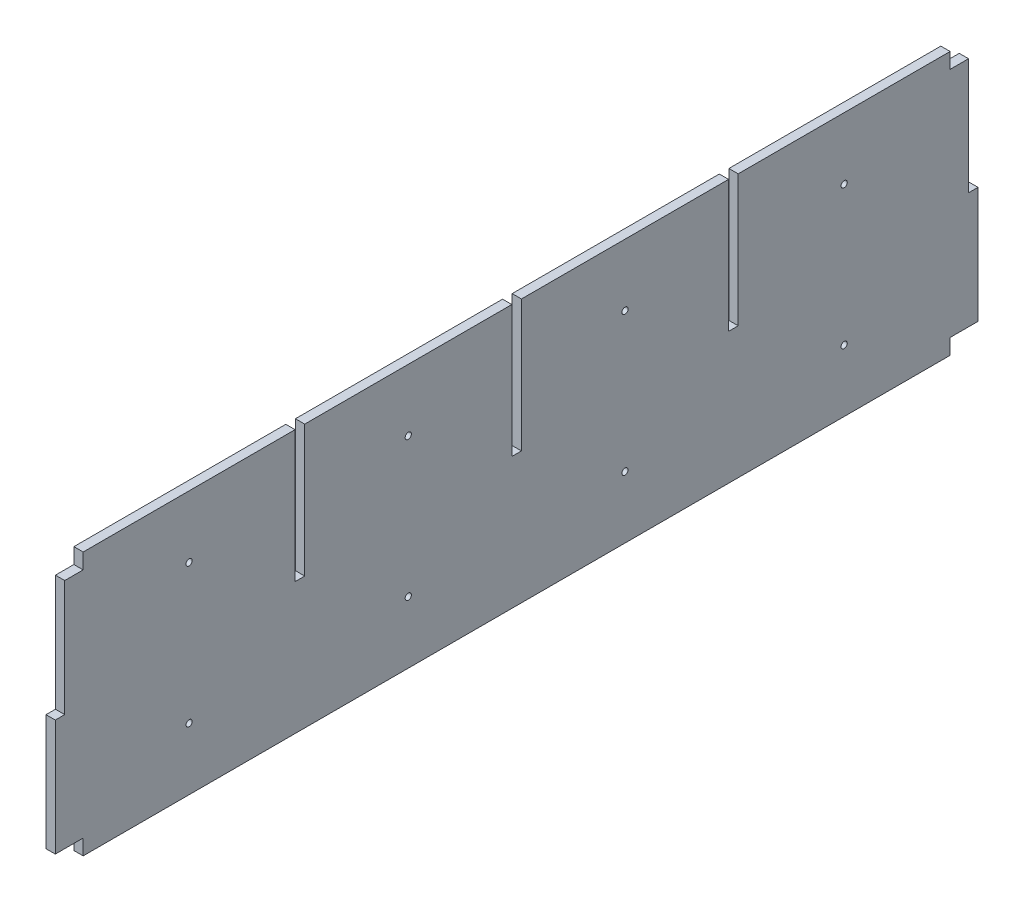
ISO-10303-21;
HEADER;
FILE_DESCRIPTION(('STEP AP214'),'2;1');
FILE_NAME('part.step','',(''),(''),'','','');
FILE_SCHEMA(('AUTOMOTIVE_DESIGN { 1 0 10303 214 1 1 1 1 }'));
ENDSEC;
DATA;
#1=APPLICATION_CONTEXT('core data for automotive mechanical design processes');
#2=APPLICATION_PROTOCOL_DEFINITION('international standard','automotive_design',2000,#1);
#3=PRODUCT_CONTEXT('',#1,'mechanical');
#4=PRODUCT('Part','Part','',(#3));
#5=PRODUCT_RELATED_PRODUCT_CATEGORY('part','',(#4));
#6=PRODUCT_DEFINITION_FORMATION('','',#4);
#7=PRODUCT_DEFINITION_CONTEXT('part definition',#1,'design');
#8=PRODUCT_DEFINITION('design','',#6,#7);
#9=PRODUCT_DEFINITION_SHAPE('','',#8);
#10=(LENGTH_UNIT() NAMED_UNIT(*) SI_UNIT(.MILLI.,.METRE.));
#11=(NAMED_UNIT(*) PLANE_ANGLE_UNIT() SI_UNIT($,.RADIAN.));
#12=(NAMED_UNIT(*) SI_UNIT($,.STERADIAN.) SOLID_ANGLE_UNIT());
#13=UNCERTAINTY_MEASURE_WITH_UNIT(LENGTH_MEASURE(1.E-05),#10,'distance_accuracy_value','');
#14=(GEOMETRIC_REPRESENTATION_CONTEXT(3) GLOBAL_UNCERTAINTY_ASSIGNED_CONTEXT((#13)) GLOBAL_UNIT_ASSIGNED_CONTEXT((#10,
#11,#12)) REPRESENTATION_CONTEXT('',''));
#15=CARTESIAN_POINT('',(0.,0.,0.));
#16=DIRECTION('',(0.,0.,1.));
#17=DIRECTION('',(1.,0.,0.));
#18=AXIS2_PLACEMENT_3D('',#15,#16,#17);
#19=CARTESIAN_POINT('',(6.,170.,-560.));
#20=DIRECTION('',(0.,-1.,0.));
#21=DIRECTION('',(0.,0.,-1.));
#22=AXIS2_PLACEMENT_3D('',#19,#20,#21);
#23=PLANE('',#22);
#24=DIRECTION('',(0.,0.,1.));
#25=VECTOR('',#24,1.);
#26=CARTESIAN_POINT('',(6.,170.,-560.));
#27=LINE('',#26,#25);
#28=CARTESIAN_POINT('',(6.,170.,-276.9));
#29=VERTEX_POINT('',#28);
#30=CARTESIAN_POINT('',(6.,170.,-143.1));
#31=VERTEX_POINT('',#30);
#32=EDGE_CURVE('E334',#29,#31,#27,.T.);
#33=ORIENTED_EDGE('',*,*,#32,.F.);
#34=DIRECTION('',(1.,0.,0.));
#35=VECTOR('',#34,1.);
#36=CARTESIAN_POINT('',(0.,170.,-276.9));
#37=LINE('',#36,#35);
#38=CARTESIAN_POINT('',(0.,170.,-276.9));
#39=VERTEX_POINT('',#38);
#40=EDGE_CURVE('E251',#39,#29,#37,.T.);
#41=ORIENTED_EDGE('',*,*,#40,.F.);
#42=DIRECTION('',(0.,0.,1.));
#43=VECTOR('',#42,1.);
#44=CARTESIAN_POINT('',(0.,170.,-560.));
#45=LINE('',#44,#43);
#46=CARTESIAN_POINT('',(0.,170.,-143.1));
#47=VERTEX_POINT('',#46);
#48=EDGE_CURVE('E238',#39,#47,#45,.T.);
#49=ORIENTED_EDGE('',*,*,#48,.T.);
#50=DIRECTION('',(1.,0.,0.));
#51=VECTOR('',#50,1.);
#52=CARTESIAN_POINT('',(0.,170.,-143.1));
#53=LINE('',#52,#51);
#54=EDGE_CURVE('E302',#47,#31,#53,.T.);
#55=ORIENTED_EDGE('',*,*,#54,.T.);
#56=EDGE_LOOP('',(#33,#41,#49,#55));
#57=FACE_BOUND('',#56,.T.);
#58=ADVANCED_FACE('F33',(#57),#23,.F.);
#59=CARTESIAN_POINT('',(0.,170.,-416.9));
#60=VERTEX_POINT('',#59);
#61=CARTESIAN_POINT('',(0.,170.,-283.1));
#62=VERTEX_POINT('',#61);
#63=EDGE_CURVE('E370',#60,#62,#45,.T.);
#64=ORIENTED_EDGE('',*,*,#63,.T.);
#65=DIRECTION('',(1.,0.,0.));
#66=VECTOR('',#65,1.);
#67=CARTESIAN_POINT('',(0.,170.,-283.1));
#68=LINE('',#67,#66);
#69=CARTESIAN_POINT('',(6.,170.,-283.1));
#70=VERTEX_POINT('',#69);
#71=EDGE_CURVE('E254',#62,#70,#68,.T.);
#72=ORIENTED_EDGE('',*,*,#71,.T.);
#73=CARTESIAN_POINT('',(6.,170.,-416.9));
#74=VERTEX_POINT('',#73);
#75=EDGE_CURVE('E333',#74,#70,#27,.T.);
#76=ORIENTED_EDGE('',*,*,#75,.F.);
#77=DIRECTION('',(1.,0.,0.));
#78=VECTOR('',#77,1.);
#79=CARTESIAN_POINT('',(0.,170.,-416.9));
#80=LINE('',#79,#78);
#81=EDGE_CURVE('E249',#60,#74,#80,.T.);
#82=ORIENTED_EDGE('',*,*,#81,.F.);
#83=EDGE_LOOP('',(#64,#72,#76,#82));
#84=FACE_BOUND('',#83,.T.);
#85=ADVANCED_FACE('F487',(#84),#23,.F.);
#86=CARTESIAN_POINT('',(6.,170.,-136.9));
#87=VERTEX_POINT('',#86);
#88=CARTESIAN_POINT('',(6.,170.,0.));
#89=VERTEX_POINT('',#88);
#90=EDGE_CURVE('E328',#87,#89,#27,.T.);
#91=ORIENTED_EDGE('',*,*,#90,.F.);
#92=DIRECTION('',(1.,0.,0.));
#93=VECTOR('',#92,1.);
#94=CARTESIAN_POINT('',(0.,170.,-136.9));
#95=LINE('',#94,#93);
#96=CARTESIAN_POINT('',(0.,170.,-136.9));
#97=VERTEX_POINT('',#96);
#98=EDGE_CURVE('E299',#97,#87,#95,.T.);
#99=ORIENTED_EDGE('',*,*,#98,.F.);
#100=CARTESIAN_POINT('',(0.,170.,0.));
#101=VERTEX_POINT('',#100);
#102=EDGE_CURVE('E365',#97,#101,#45,.T.);
#103=ORIENTED_EDGE('',*,*,#102,.T.);
#104=DIRECTION('',(-1.,0.,0.));
#105=VECTOR('',#104,1.);
#106=CARTESIAN_POINT('',(6.,170.,0.));
#107=LINE('',#106,#105);
#108=EDGE_CURVE('E398',#89,#101,#107,.T.);
#109=ORIENTED_EDGE('',*,*,#108,.F.);
#110=EDGE_LOOP('',(#91,#99,#103,#109));
#111=FACE_BOUND('',#110,.T.);
#112=ADVANCED_FACE('F534',(#111),#23,.F.);
#113=CARTESIAN_POINT('',(6.,10.,0.));
#114=DIRECTION('',(0.,0.,-1.));
#115=DIRECTION('',(-1.,0.,0.));
#116=AXIS2_PLACEMENT_3D('',#113,#114,#115);
#117=PLANE('',#116);
#118=DIRECTION('',(0.,-1.,0.));
#119=VECTOR('',#118,1.);
#120=CARTESIAN_POINT('',(0.,10.,0.));
#121=LINE('',#120,#119);
#122=CARTESIAN_POINT('',(0.,10.,0.));
#123=VERTEX_POINT('',#122);
#124=CARTESIAN_POINT('',(0.,0.,0.));
#125=VERTEX_POINT('',#124);
#126=EDGE_CURVE('E301',#123,#125,#121,.T.);
#127=ORIENTED_EDGE('',*,*,#126,.T.);
#128=DIRECTION('',(-1.,0.,0.));
#129=VECTOR('',#128,1.);
#130=CARTESIAN_POINT('',(6.,0.,0.));
#131=LINE('',#130,#129);
#132=CARTESIAN_POINT('',(6.,0.,0.));
#133=VERTEX_POINT('',#132);
#134=EDGE_CURVE('E11',#133,#125,#131,.T.);
#135=ORIENTED_EDGE('',*,*,#134,.F.);
#136=DIRECTION('',(0.,-1.,0.));
#137=VECTOR('',#136,1.);
#138=CARTESIAN_POINT('',(6.,10.,0.));
#139=LINE('',#138,#137);
#140=CARTESIAN_POINT('',(6.,10.,0.));
#141=VERTEX_POINT('',#140);
#142=EDGE_CURVE('E308',#141,#133,#139,.T.);
#143=ORIENTED_EDGE('',*,*,#142,.F.);
#144=DIRECTION('',(-1.,0.,0.));
#145=VECTOR('',#144,1.);
#146=CARTESIAN_POINT('',(6.,10.,0.));
#147=LINE('',#146,#145);
#148=EDGE_CURVE('E346',#141,#123,#147,.T.);
#149=ORIENTED_EDGE('',*,*,#148,.T.);
#150=EDGE_LOOP('',(#127,#135,#143,#149));
#151=FACE_BOUND('',#150,.T.);
#152=ADVANCED_FACE('F35',(#151),#117,.F.);
#153=CARTESIAN_POINT('',(6.,0.,0.));
#154=DIRECTION('',(0.,1.,0.));
#155=DIRECTION('',(0.,0.,1.));
#156=AXIS2_PLACEMENT_3D('',#153,#154,#155);
#157=PLANE('',#156);
#158=DIRECTION('',(0.,0.,-1.));
#159=VECTOR('',#158,1.);
#160=CARTESIAN_POINT('',(0.,0.,0.));
#161=LINE('',#160,#159);
#162=CARTESIAN_POINT('',(0.,0.,-560.));
#163=VERTEX_POINT('',#162);
#164=EDGE_CURVE('E349',#125,#163,#161,.T.);
#165=ORIENTED_EDGE('',*,*,#164,.T.);
#166=DIRECTION('',(-1.,0.,0.));
#167=VECTOR('',#166,1.);
#168=CARTESIAN_POINT('',(6.,0.,-560.));
#169=LINE('',#168,#167);
#170=CARTESIAN_POINT('',(6.,0.,-560.));
#171=VERTEX_POINT('',#170);
#172=EDGE_CURVE('E41',#171,#163,#169,.T.);
#173=ORIENTED_EDGE('',*,*,#172,.F.);
#174=DIRECTION('',(0.,0.,-1.));
#175=VECTOR('',#174,1.);
#176=CARTESIAN_POINT('',(6.,0.,0.));
#177=LINE('',#176,#175);
#178=EDGE_CURVE('E311',#133,#171,#177,.T.);
#179=ORIENTED_EDGE('',*,*,#178,.F.);
#180=ORIENTED_EDGE('',*,*,#134,.T.);
#181=EDGE_LOOP('',(#165,#173,#179,#180));
#182=FACE_BOUND('',#181,.T.);
#183=ADVANCED_FACE('F447',(#182),#157,.F.);
#184=CARTESIAN_POINT('',(6.,0.,-560.));
#185=DIRECTION('',(0.,0.,1.));
#186=DIRECTION('',(1.,0.,0.));
#187=AXIS2_PLACEMENT_3D('',#184,#185,#186);
#188=PLANE('',#187);
#189=DIRECTION('',(0.,1.,0.));
#190=VECTOR('',#189,1.);
#191=CARTESIAN_POINT('',(0.,0.,-560.));
#192=LINE('',#191,#190);
#193=CARTESIAN_POINT('',(0.,10.,-560.));
#194=VERTEX_POINT('',#193);
#195=EDGE_CURVE('E351',#163,#194,#192,.T.);
#196=ORIENTED_EDGE('',*,*,#195,.T.);
#197=DIRECTION('',(-1.,0.,0.));
#198=VECTOR('',#197,1.);
#199=CARTESIAN_POINT('',(6.,10.,-560.));
#200=LINE('',#199,#198);
#201=CARTESIAN_POINT('',(6.,10.,-560.));
#202=VERTEX_POINT('',#201);
#203=EDGE_CURVE('E419',#202,#194,#200,.T.);
#204=ORIENTED_EDGE('',*,*,#203,.F.);
#205=DIRECTION('',(0.,1.,0.));
#206=VECTOR('',#205,1.);
#207=CARTESIAN_POINT('',(6.,0.,-560.));
#208=LINE('',#207,#206);
#209=EDGE_CURVE('E314',#171,#202,#208,.T.);
#210=ORIENTED_EDGE('',*,*,#209,.F.);
#211=ORIENTED_EDGE('',*,*,#172,.T.);
#212=EDGE_LOOP('',(#196,#204,#210,#211));
#213=FACE_BOUND('',#212,.T.);
#214=ADVANCED_FACE('F426',(#213),#188,.F.);
#215=CARTESIAN_POINT('',(6.,10.,-560.));
#216=DIRECTION('',(0.,1.,0.));
#217=DIRECTION('',(0.,0.,1.));
#218=AXIS2_PLACEMENT_3D('',#215,#216,#217);
#219=PLANE('',#218);
#220=DIRECTION('',(0.,0.,-1.));
#221=VECTOR('',#220,1.);
#222=CARTESIAN_POINT('',(0.,10.,-560.));
#223=LINE('',#222,#221);
#224=CARTESIAN_POINT('',(0.,10.,-578.));
#225=VERTEX_POINT('',#224);
#226=EDGE_CURVE('E353',#194,#225,#223,.T.);
#227=ORIENTED_EDGE('',*,*,#226,.T.);
#228=DIRECTION('',(-1.,0.,0.));
#229=VECTOR('',#228,1.);
#230=CARTESIAN_POINT('',(6.,10.,-578.));
#231=LINE('',#230,#229);
#232=CARTESIAN_POINT('',(6.,10.,-578.));
#233=VERTEX_POINT('',#232);
#234=EDGE_CURVE('E416',#233,#225,#231,.T.);
#235=ORIENTED_EDGE('',*,*,#234,.F.);
#236=DIRECTION('',(0.,0.,-1.));
#237=VECTOR('',#236,1.);
#238=CARTESIAN_POINT('',(6.,10.,-560.));
#239=LINE('',#238,#237);
#240=EDGE_CURVE('E316',#202,#233,#239,.T.);
#241=ORIENTED_EDGE('',*,*,#240,.F.);
#242=ORIENTED_EDGE('',*,*,#203,.T.);
#243=EDGE_LOOP('',(#227,#235,#241,#242));
#244=FACE_BOUND('',#243,.T.);
#245=ADVANCED_FACE('F435',(#244),#219,.F.);
#246=CARTESIAN_POINT('',(6.,10.,-578.));
#247=DIRECTION('',(0.,0.,1.));
#248=DIRECTION('',(1.,0.,0.));
#249=AXIS2_PLACEMENT_3D('',#246,#247,#248);
#250=PLANE('',#249);
#251=DIRECTION('',(0.,1.,0.));
#252=VECTOR('',#251,1.);
#253=CARTESIAN_POINT('',(0.,10.,-578.));
#254=LINE('',#253,#252);
#255=CARTESIAN_POINT('',(0.,85.,-578.));
#256=VERTEX_POINT('',#255);
#257=EDGE_CURVE('E355',#225,#256,#254,.T.);
#258=ORIENTED_EDGE('',*,*,#257,.T.);
#259=DIRECTION('',(-1.,0.,0.));
#260=VECTOR('',#259,1.);
#261=CARTESIAN_POINT('',(6.,85.,-578.));
#262=LINE('',#261,#260);
#263=CARTESIAN_POINT('',(6.,85.,-578.));
#264=VERTEX_POINT('',#263);
#265=EDGE_CURVE('E413',#264,#256,#262,.T.);
#266=ORIENTED_EDGE('',*,*,#265,.F.);
#267=DIRECTION('',(0.,1.,0.));
#268=VECTOR('',#267,1.);
#269=CARTESIAN_POINT('',(6.,10.,-578.));
#270=LINE('',#269,#268);
#271=EDGE_CURVE('E318',#233,#264,#270,.T.);
#272=ORIENTED_EDGE('',*,*,#271,.F.);
#273=ORIENTED_EDGE('',*,*,#234,.T.);
#274=EDGE_LOOP('',(#258,#266,#272,#273));
#275=FACE_BOUND('',#274,.T.);
#276=ADVANCED_FACE('F439',(#275),#250,.F.);
#277=CARTESIAN_POINT('',(6.,85.,-578.));
#278=DIRECTION('',(0.,-1.,0.));
#279=DIRECTION('',(0.,0.,-1.));
#280=AXIS2_PLACEMENT_3D('',#277,#278,#279);
#281=PLANE('',#280);
#282=DIRECTION('',(0.,0.,1.));
#283=VECTOR('',#282,1.);
#284=CARTESIAN_POINT('',(0.,85.,-578.));
#285=LINE('',#284,#283);
#286=CARTESIAN_POINT('',(0.,85.,-571.9));
#287=VERTEX_POINT('',#286);
#288=EDGE_CURVE('E357',#256,#287,#285,.T.);
#289=ORIENTED_EDGE('',*,*,#288,.T.);
#290=DIRECTION('',(-1.,0.,0.));
#291=VECTOR('',#290,1.);
#292=CARTESIAN_POINT('',(6.,85.,-571.9));
#293=LINE('',#292,#291);
#294=CARTESIAN_POINT('',(6.,85.,-571.9));
#295=VERTEX_POINT('',#294);
#296=EDGE_CURVE('E410',#295,#287,#293,.T.);
#297=ORIENTED_EDGE('',*,*,#296,.F.);
#298=DIRECTION('',(0.,0.,1.));
#299=VECTOR('',#298,1.);
#300=CARTESIAN_POINT('',(6.,85.,-578.));
#301=LINE('',#300,#299);
#302=EDGE_CURVE('E320',#264,#295,#301,.T.);
#303=ORIENTED_EDGE('',*,*,#302,.F.);
#304=ORIENTED_EDGE('',*,*,#265,.T.);
#305=EDGE_LOOP('',(#289,#297,#303,#304));
#306=FACE_BOUND('',#305,.T.);
#307=ADVANCED_FACE('F519',(#306),#281,.F.);
#308=CARTESIAN_POINT('',(6.,85.,-571.9));
#309=DIRECTION('',(0.,0.,1.));
#310=DIRECTION('',(1.,0.,0.));
#311=AXIS2_PLACEMENT_3D('',#308,#309,#310);
#312=PLANE('',#311);
#313=DIRECTION('',(0.,1.,0.));
#314=VECTOR('',#313,1.);
#315=CARTESIAN_POINT('',(0.,85.,-571.9));
#316=LINE('',#315,#314);
#317=CARTESIAN_POINT('',(0.,160.,-571.9));
#318=VERTEX_POINT('',#317);
#319=EDGE_CURVE('E359',#287,#318,#316,.T.);
#320=ORIENTED_EDGE('',*,*,#319,.T.);
#321=DIRECTION('',(-1.,0.,0.));
#322=VECTOR('',#321,1.);
#323=CARTESIAN_POINT('',(6.,160.,-571.9));
#324=LINE('',#323,#322);
#325=CARTESIAN_POINT('',(6.,160.,-571.9));
#326=VERTEX_POINT('',#325);
#327=EDGE_CURVE('E407',#326,#318,#324,.T.);
#328=ORIENTED_EDGE('',*,*,#327,.F.);
#329=DIRECTION('',(0.,1.,0.));
#330=VECTOR('',#329,1.);
#331=CARTESIAN_POINT('',(6.,85.,-571.9));
#332=LINE('',#331,#330);
#333=EDGE_CURVE('E322',#295,#326,#332,.T.);
#334=ORIENTED_EDGE('',*,*,#333,.F.);
#335=ORIENTED_EDGE('',*,*,#296,.T.);
#336=EDGE_LOOP('',(#320,#328,#334,#335));
#337=FACE_BOUND('',#336,.T.);
#338=ADVANCED_FACE('F517',(#337),#312,.F.);
#339=CARTESIAN_POINT('',(6.,160.,-571.9));
#340=DIRECTION('',(0.,-1.,0.));
#341=DIRECTION('',(0.,0.,-1.));
#342=AXIS2_PLACEMENT_3D('',#339,#340,#341);
#343=PLANE('',#342);
#344=DIRECTION('',(0.,0.,1.));
#345=VECTOR('',#344,1.);
#346=CARTESIAN_POINT('',(0.,160.,-571.9));
#347=LINE('',#346,#345);
#348=CARTESIAN_POINT('',(0.,160.,-560.));
#349=VERTEX_POINT('',#348);
#350=EDGE_CURVE('E361',#318,#349,#347,.T.);
#351=ORIENTED_EDGE('',*,*,#350,.T.);
#352=DIRECTION('',(-1.,0.,0.));
#353=VECTOR('',#352,1.);
#354=CARTESIAN_POINT('',(6.,160.,-560.));
#355=LINE('',#354,#353);
#356=CARTESIAN_POINT('',(6.,160.,-560.));
#357=VERTEX_POINT('',#356);
#358=EDGE_CURVE('E404',#357,#349,#355,.T.);
#359=ORIENTED_EDGE('',*,*,#358,.F.);
#360=DIRECTION('',(0.,0.,1.));
#361=VECTOR('',#360,1.);
#362=CARTESIAN_POINT('',(6.,160.,-571.9));
#363=LINE('',#362,#361);
#364=EDGE_CURVE('E324',#326,#357,#363,.T.);
#365=ORIENTED_EDGE('',*,*,#364,.F.);
#366=ORIENTED_EDGE('',*,*,#327,.T.);
#367=EDGE_LOOP('',(#351,#359,#365,#366));
#368=FACE_BOUND('',#367,.T.);
#369=ADVANCED_FACE('F513',(#368),#343,.F.);
#370=CARTESIAN_POINT('',(6.,160.,-560.));
#371=DIRECTION('',(0.,0.,1.));
#372=DIRECTION('',(1.,0.,0.));
#373=AXIS2_PLACEMENT_3D('',#370,#371,#372);
#374=PLANE('',#373);
#375=DIRECTION('',(0.,1.,0.));
#376=VECTOR('',#375,1.);
#377=CARTESIAN_POINT('',(0.,160.,-560.));
#378=LINE('',#377,#376);
#379=CARTESIAN_POINT('',(0.,170.,-560.));
#380=VERTEX_POINT('',#379);
#381=EDGE_CURVE('E363',#349,#380,#378,.T.);
#382=ORIENTED_EDGE('',*,*,#381,.T.);
#383=DIRECTION('',(-1.,0.,0.));
#384=VECTOR('',#383,1.);
#385=CARTESIAN_POINT('',(6.,170.,-560.));
#386=LINE('',#385,#384);
#387=CARTESIAN_POINT('',(6.,170.,-560.));
#388=VERTEX_POINT('',#387);
#389=EDGE_CURVE('E401',#388,#380,#386,.T.);
#390=ORIENTED_EDGE('',*,*,#389,.F.);
#391=DIRECTION('',(0.,1.,0.));
#392=VECTOR('',#391,1.);
#393=CARTESIAN_POINT('',(6.,160.,-560.));
#394=LINE('',#393,#392);
#395=EDGE_CURVE('E326',#357,#388,#394,.T.);
#396=ORIENTED_EDGE('',*,*,#395,.F.);
#397=ORIENTED_EDGE('',*,*,#358,.T.);
#398=EDGE_LOOP('',(#382,#390,#396,#397));
#399=FACE_BOUND('',#398,.T.);
#400=ADVANCED_FACE('F508',(#399),#374,.F.);
#401=CARTESIAN_POINT('',(0.,170.,-423.1));
#402=VERTEX_POINT('',#401);
#403=EDGE_CURVE('E366',#380,#402,#45,.T.);
#404=ORIENTED_EDGE('',*,*,#403,.T.);
#405=DIRECTION('',(1.,0.,0.));
#406=VECTOR('',#405,1.);
#407=CARTESIAN_POINT('',(0.,170.,-423.1));
#408=LINE('',#407,#406);
#409=CARTESIAN_POINT('',(6.,170.,-423.1));
#410=VERTEX_POINT('',#409);
#411=EDGE_CURVE('E276',#402,#410,#408,.T.);
#412=ORIENTED_EDGE('',*,*,#411,.T.);
#413=EDGE_CURVE('E329',#388,#410,#27,.T.);
#414=ORIENTED_EDGE('',*,*,#413,.F.);
#415=ORIENTED_EDGE('',*,*,#389,.T.);
#416=EDGE_LOOP('',(#404,#412,#414,#415));
#417=FACE_BOUND('',#416,.T.);
#418=ADVANCED_FACE('F501',(#417),#23,.F.);
#419=CARTESIAN_POINT('',(6.,170.,0.));
#420=DIRECTION('',(0.,0.,-1.));
#421=DIRECTION('',(-1.,0.,0.));
#422=AXIS2_PLACEMENT_3D('',#419,#420,#421);
#423=PLANE('',#422);
#424=DIRECTION('',(0.,-1.,0.));
#425=VECTOR('',#424,1.);
#426=CARTESIAN_POINT('',(0.,170.,0.));
#427=LINE('',#426,#425);
#428=CARTESIAN_POINT('',(0.,160.,0.));
#429=VERTEX_POINT('',#428);
#430=EDGE_CURVE('E369',#101,#429,#427,.T.);
#431=ORIENTED_EDGE('',*,*,#430,.T.);
#432=DIRECTION('',(-1.,0.,0.));
#433=VECTOR('',#432,1.);
#434=CARTESIAN_POINT('',(6.,160.,0.));
#435=LINE('',#434,#433);
#436=CARTESIAN_POINT('',(6.,160.,0.));
#437=VERTEX_POINT('',#436);
#438=EDGE_CURVE('E395',#437,#429,#435,.T.);
#439=ORIENTED_EDGE('',*,*,#438,.F.);
#440=DIRECTION('',(0.,-1.,0.));
#441=VECTOR('',#440,1.);
#442=CARTESIAN_POINT('',(6.,170.,0.));
#443=LINE('',#442,#441);
#444=EDGE_CURVE('E332',#89,#437,#443,.T.);
#445=ORIENTED_EDGE('',*,*,#444,.F.);
#446=ORIENTED_EDGE('',*,*,#108,.T.);
#447=EDGE_LOOP('',(#431,#439,#445,#446));
#448=FACE_BOUND('',#447,.T.);
#449=ADVANCED_FACE('F478',(#448),#423,.F.);
#450=CARTESIAN_POINT('',(6.,160.,0.));
#451=DIRECTION('',(0.,-1.,0.));
#452=DIRECTION('',(0.,0.,-1.));
#453=AXIS2_PLACEMENT_3D('',#450,#451,#452);
#454=PLANE('',#453);
#455=DIRECTION('',(0.,0.,1.));
#456=VECTOR('',#455,1.);
#457=CARTESIAN_POINT('',(0.,160.,0.));
#458=LINE('',#457,#456);
#459=CARTESIAN_POINT('',(0.,160.,11.9));
#460=VERTEX_POINT('',#459);
#461=EDGE_CURVE('E372',#429,#460,#458,.T.);
#462=ORIENTED_EDGE('',*,*,#461,.T.);
#463=DIRECTION('',(-1.,0.,0.));
#464=VECTOR('',#463,1.);
#465=CARTESIAN_POINT('',(6.,160.,11.9));
#466=LINE('',#465,#464);
#467=CARTESIAN_POINT('',(6.,160.,11.9));
#468=VERTEX_POINT('',#467);
#469=EDGE_CURVE('E392',#468,#460,#466,.T.);
#470=ORIENTED_EDGE('',*,*,#469,.F.);
#471=DIRECTION('',(0.,0.,1.));
#472=VECTOR('',#471,1.);
#473=CARTESIAN_POINT('',(6.,160.,0.));
#474=LINE('',#473,#472);
#475=EDGE_CURVE('E336',#437,#468,#474,.T.);
#476=ORIENTED_EDGE('',*,*,#475,.F.);
#477=ORIENTED_EDGE('',*,*,#438,.T.);
#478=EDGE_LOOP('',(#462,#470,#476,#477));
#479=FACE_BOUND('',#478,.T.);
#480=ADVANCED_FACE('F474',(#479),#454,.F.);
#481=CARTESIAN_POINT('',(6.,160.,11.9));
#482=DIRECTION('',(0.,0.,-1.));
#483=DIRECTION('',(-1.,0.,0.));
#484=AXIS2_PLACEMENT_3D('',#481,#482,#483);
#485=PLANE('',#484);
#486=DIRECTION('',(0.,-1.,0.));
#487=VECTOR('',#486,1.);
#488=CARTESIAN_POINT('',(0.,160.,11.9));
#489=LINE('',#488,#487);
#490=CARTESIAN_POINT('',(0.,85.,11.9));
#491=VERTEX_POINT('',#490);
#492=EDGE_CURVE('E374',#460,#491,#489,.T.);
#493=ORIENTED_EDGE('',*,*,#492,.T.);
#494=DIRECTION('',(-1.,0.,0.));
#495=VECTOR('',#494,1.);
#496=CARTESIAN_POINT('',(6.,85.,11.9));
#497=LINE('',#496,#495);
#498=CARTESIAN_POINT('',(6.,85.,11.9));
#499=VERTEX_POINT('',#498);
#500=EDGE_CURVE('E389',#499,#491,#497,.T.);
#501=ORIENTED_EDGE('',*,*,#500,.F.);
#502=DIRECTION('',(0.,-1.,0.));
#503=VECTOR('',#502,1.);
#504=CARTESIAN_POINT('',(6.,160.,11.9));
#505=LINE('',#504,#503);
#506=EDGE_CURVE('E338',#468,#499,#505,.T.);
#507=ORIENTED_EDGE('',*,*,#506,.F.);
#508=ORIENTED_EDGE('',*,*,#469,.T.);
#509=EDGE_LOOP('',(#493,#501,#507,#508));
#510=FACE_BOUND('',#509,.T.);
#511=ADVANCED_FACE('F469',(#510),#485,.F.);
#512=CARTESIAN_POINT('',(6.,85.,11.9));
#513=DIRECTION('',(0.,-1.,0.));
#514=DIRECTION('',(0.,0.,-1.));
#515=AXIS2_PLACEMENT_3D('',#512,#513,#514);
#516=PLANE('',#515);
#517=DIRECTION('',(0.,0.,1.));
#518=VECTOR('',#517,1.);
#519=CARTESIAN_POINT('',(0.,85.,11.9));
#520=LINE('',#519,#518);
#521=CARTESIAN_POINT('',(0.,85.,18.));
#522=VERTEX_POINT('',#521);
#523=EDGE_CURVE('E376',#491,#522,#520,.T.);
#524=ORIENTED_EDGE('',*,*,#523,.T.);
#525=DIRECTION('',(-1.,0.,0.));
#526=VECTOR('',#525,1.);
#527=CARTESIAN_POINT('',(6.,85.,18.));
#528=LINE('',#527,#526);
#529=CARTESIAN_POINT('',(6.,85.,18.));
#530=VERTEX_POINT('',#529);
#531=EDGE_CURVE('E386',#530,#522,#528,.T.);
#532=ORIENTED_EDGE('',*,*,#531,.F.);
#533=DIRECTION('',(0.,0.,1.));
#534=VECTOR('',#533,1.);
#535=CARTESIAN_POINT('',(6.,85.,11.9));
#536=LINE('',#535,#534);
#537=EDGE_CURVE('E340',#499,#530,#536,.T.);
#538=ORIENTED_EDGE('',*,*,#537,.F.);
#539=ORIENTED_EDGE('',*,*,#500,.T.);
#540=EDGE_LOOP('',(#524,#532,#538,#539));
#541=FACE_BOUND('',#540,.T.);
#542=ADVANCED_FACE('F463',(#541),#516,.F.);
#543=CARTESIAN_POINT('',(6.,85.,18.));
#544=DIRECTION('',(0.,0.,-1.));
#545=DIRECTION('',(-1.,0.,0.));
#546=AXIS2_PLACEMENT_3D('',#543,#544,#545);
#547=PLANE('',#546);
#548=DIRECTION('',(0.,-1.,0.));
#549=VECTOR('',#548,1.);
#550=CARTESIAN_POINT('',(0.,85.,18.));
#551=LINE('',#550,#549);
#552=CARTESIAN_POINT('',(0.,10.,18.));
#553=VERTEX_POINT('',#552);
#554=EDGE_CURVE('E378',#522,#553,#551,.T.);
#555=ORIENTED_EDGE('',*,*,#554,.T.);
#556=DIRECTION('',(-1.,0.,0.));
#557=VECTOR('',#556,1.);
#558=CARTESIAN_POINT('',(6.,10.,18.));
#559=LINE('',#558,#557);
#560=CARTESIAN_POINT('',(6.,10.,18.));
#561=VERTEX_POINT('',#560);
#562=EDGE_CURVE('E383',#561,#553,#559,.T.);
#563=ORIENTED_EDGE('',*,*,#562,.F.);
#564=DIRECTION('',(0.,-1.,0.));
#565=VECTOR('',#564,1.);
#566=CARTESIAN_POINT('',(6.,85.,18.));
#567=LINE('',#566,#565);
#568=EDGE_CURVE('E342',#530,#561,#567,.T.);
#569=ORIENTED_EDGE('',*,*,#568,.F.);
#570=ORIENTED_EDGE('',*,*,#531,.T.);
#571=EDGE_LOOP('',(#555,#563,#569,#570));
#572=FACE_BOUND('',#571,.T.);
#573=ADVANCED_FACE('F459',(#572),#547,.F.);
#574=CARTESIAN_POINT('',(6.,10.,18.));
#575=DIRECTION('',(0.,1.,0.));
#576=DIRECTION('',(0.,0.,1.));
#577=AXIS2_PLACEMENT_3D('',#574,#575,#576);
#578=PLANE('',#577);
#579=DIRECTION('',(0.,0.,-1.));
#580=VECTOR('',#579,1.);
#581=CARTESIAN_POINT('',(0.,10.,18.));
#582=LINE('',#581,#580);
#583=EDGE_CURVE('E312',#553,#123,#582,.T.);
#584=ORIENTED_EDGE('',*,*,#583,.T.);
#585=ORIENTED_EDGE('',*,*,#148,.F.);
#586=DIRECTION('',(0.,0.,-1.));
#587=VECTOR('',#586,1.);
#588=CARTESIAN_POINT('',(6.,10.,18.));
#589=LINE('',#588,#587);
#590=EDGE_CURVE('E344',#561,#141,#589,.T.);
#591=ORIENTED_EDGE('',*,*,#590,.F.);
#592=ORIENTED_EDGE('',*,*,#562,.T.);
#593=EDGE_LOOP('',(#584,#585,#591,#592));
#594=FACE_BOUND('',#593,.T.);
#595=ADVANCED_FACE('F454',(#594),#578,.F.);
#596=CARTESIAN_POINT('',(6.,0.,0.));
#597=DIRECTION('',(1.,0.,0.));
#598=DIRECTION('',(0.,0.,-1.));
#599=AXIS2_PLACEMENT_3D('',#596,#597,#598);
#600=PLANE('',#599);
#601=CARTESIAN_POINT('',(6.,40.,-68.45));
#602=DIRECTION('',(1.,0.,0.));
#603=DIRECTION('',(0.,0.,-1.));
#604=AXIS2_PLACEMENT_3D('',#601,#602,#603);
#605=CIRCLE('',#604,2.);
#606=CARTESIAN_POINT('',(6.,40.,-70.45));
#607=VERTEX_POINT('',#606);
#608=EDGE_CURVE('E749',#607,#607,#605,.T.);
#609=ORIENTED_EDGE('',*,*,#608,.F.);
#610=EDGE_LOOP('',(#609));
#611=FACE_BOUND('',#610,.T.);
#612=CARTESIAN_POINT('',(6.,130.,-210.));
#613=DIRECTION('',(1.,0.,0.));
#614=DIRECTION('',(0.,0.,-1.));
#615=AXIS2_PLACEMENT_3D('',#612,#613,#614);
#616=CIRCLE('',#615,2.);
#617=CARTESIAN_POINT('',(6.,130.,-212.));
#618=VERTEX_POINT('',#617);
#619=EDGE_CURVE('E754',#618,#618,#616,.T.);
#620=ORIENTED_EDGE('',*,*,#619,.F.);
#621=EDGE_LOOP('',(#620));
#622=FACE_BOUND('',#621,.T.);
#623=CARTESIAN_POINT('',(6.,40.,-210.));
#624=DIRECTION('',(1.,0.,0.));
#625=DIRECTION('',(0.,0.,-1.));
#626=AXIS2_PLACEMENT_3D('',#623,#624,#625);
#627=CIRCLE('',#626,2.);
#628=CARTESIAN_POINT('',(6.,40.,-212.));
#629=VERTEX_POINT('',#628);
#630=EDGE_CURVE('E762',#629,#629,#627,.T.);
#631=ORIENTED_EDGE('',*,*,#630,.F.);
#632=EDGE_LOOP('',(#631));
#633=FACE_BOUND('',#632,.T.);
#634=CARTESIAN_POINT('',(6.,130.,-350.));
#635=DIRECTION('',(1.,0.,0.));
#636=DIRECTION('',(0.,0.,-1.));
#637=AXIS2_PLACEMENT_3D('',#634,#635,#636);
#638=CIRCLE('',#637,2.);
#639=CARTESIAN_POINT('',(6.,130.,-352.));
#640=VERTEX_POINT('',#639);
#641=EDGE_CURVE('E768',#640,#640,#638,.T.);
#642=ORIENTED_EDGE('',*,*,#641,.F.);
#643=EDGE_LOOP('',(#642));
#644=FACE_BOUND('',#643,.T.);
#645=CARTESIAN_POINT('',(6.,40.,-350.));
#646=DIRECTION('',(1.,0.,0.));
#647=DIRECTION('',(0.,0.,-1.));
#648=AXIS2_PLACEMENT_3D('',#645,#646,#647);
#649=CIRCLE('',#648,2.);
#650=CARTESIAN_POINT('',(6.,40.,-352.));
#651=VERTEX_POINT('',#650);
#652=EDGE_CURVE('E774',#651,#651,#649,.T.);
#653=ORIENTED_EDGE('',*,*,#652,.F.);
#654=EDGE_LOOP('',(#653));
#655=FACE_BOUND('',#654,.T.);
#656=CARTESIAN_POINT('',(6.,130.,-491.55));
#657=DIRECTION('',(1.,0.,0.));
#658=DIRECTION('',(0.,0.,-1.));
#659=AXIS2_PLACEMENT_3D('',#656,#657,#658);
#660=CIRCLE('',#659,2.);
#661=CARTESIAN_POINT('',(6.,130.,-493.55));
#662=VERTEX_POINT('',#661);
#663=EDGE_CURVE('E780',#662,#662,#660,.T.);
#664=ORIENTED_EDGE('',*,*,#663,.F.);
#665=EDGE_LOOP('',(#664));
#666=FACE_BOUND('',#665,.T.);
#667=CARTESIAN_POINT('',(6.,40.,-491.55));
#668=DIRECTION('',(1.,0.,0.));
#669=DIRECTION('',(0.,0.,-1.));
#670=AXIS2_PLACEMENT_3D('',#667,#668,#669);
#671=CIRCLE('',#670,2.);
#672=CARTESIAN_POINT('',(6.,40.,-493.55));
#673=VERTEX_POINT('',#672);
#674=EDGE_CURVE('E786',#673,#673,#671,.T.);
#675=ORIENTED_EDGE('',*,*,#674,.F.);
#676=EDGE_LOOP('',(#675));
#677=FACE_BOUND('',#676,.T.);
#678=CARTESIAN_POINT('',(6.,130.,-68.45));
#679=DIRECTION('',(1.,0.,0.));
#680=DIRECTION('',(0.,0.,-1.));
#681=AXIS2_PLACEMENT_3D('',#678,#679,#680);
#682=CIRCLE('',#681,2.);
#683=CARTESIAN_POINT('',(6.,130.,-70.45));
#684=VERTEX_POINT('',#683);
#685=EDGE_CURVE('E244',#684,#684,#682,.T.);
#686=ORIENTED_EDGE('',*,*,#685,.F.);
#687=EDGE_LOOP('',(#686));
#688=FACE_BOUND('',#687,.T.);
#689=DIRECTION('',(0.,-1.,0.));
#690=VECTOR('',#689,1.);
#691=CARTESIAN_POINT('',(6.,170.,-276.9));
#692=LINE('',#691,#690);
#693=CARTESIAN_POINT('',(6.,85.,-276.9));
#694=VERTEX_POINT('',#693);
#695=EDGE_CURVE('E224',#29,#694,#692,.T.);
#696=ORIENTED_EDGE('',*,*,#695,.F.);
#697=ORIENTED_EDGE('',*,*,#32,.T.);
#698=DIRECTION('',(0.,1.,0.));
#699=VECTOR('',#698,1.);
#700=CARTESIAN_POINT('',(6.,170.,-143.1));
#701=LINE('',#700,#699);
#702=CARTESIAN_POINT('',(6.,85.,-143.1));
#703=VERTEX_POINT('',#702);
#704=EDGE_CURVE('E286',#703,#31,#701,.T.);
#705=ORIENTED_EDGE('',*,*,#704,.F.);
#706=DIRECTION('',(0.,0.,-1.));
#707=VECTOR('',#706,1.);
#708=CARTESIAN_POINT('',(6.,85.,-136.9));
#709=LINE('',#708,#707);
#710=CARTESIAN_POINT('',(6.,85.,-136.9));
#711=VERTEX_POINT('',#710);
#712=EDGE_CURVE('E294',#711,#703,#709,.T.);
#713=ORIENTED_EDGE('',*,*,#712,.F.);
#714=DIRECTION('',(0.,-1.,0.));
#715=VECTOR('',#714,1.);
#716=CARTESIAN_POINT('',(6.,170.,-136.9));
#717=LINE('',#716,#715);
#718=EDGE_CURVE('E253',#87,#711,#717,.T.);
#719=ORIENTED_EDGE('',*,*,#718,.F.);
#720=ORIENTED_EDGE('',*,*,#90,.T.);
#721=ORIENTED_EDGE('',*,*,#444,.T.);
#722=ORIENTED_EDGE('',*,*,#475,.T.);
#723=ORIENTED_EDGE('',*,*,#506,.T.);
#724=ORIENTED_EDGE('',*,*,#537,.T.);
#725=ORIENTED_EDGE('',*,*,#568,.T.);
#726=ORIENTED_EDGE('',*,*,#590,.T.);
#727=ORIENTED_EDGE('',*,*,#142,.T.);
#728=ORIENTED_EDGE('',*,*,#178,.T.);
#729=ORIENTED_EDGE('',*,*,#209,.T.);
#730=ORIENTED_EDGE('',*,*,#240,.T.);
#731=ORIENTED_EDGE('',*,*,#271,.T.);
#732=ORIENTED_EDGE('',*,*,#302,.T.);
#733=ORIENTED_EDGE('',*,*,#333,.T.);
#734=ORIENTED_EDGE('',*,*,#364,.T.);
#735=ORIENTED_EDGE('',*,*,#395,.T.);
#736=ORIENTED_EDGE('',*,*,#413,.T.);
#737=DIRECTION('',(0.,1.,0.));
#738=VECTOR('',#737,1.);
#739=CARTESIAN_POINT('',(6.,170.,-423.1));
#740=LINE('',#739,#738);
#741=CARTESIAN_POINT('',(6.,85.,-423.1));
#742=VERTEX_POINT('',#741);
#743=EDGE_CURVE('E262',#742,#410,#740,.T.);
#744=ORIENTED_EDGE('',*,*,#743,.F.);
#745=DIRECTION('',(0.,0.,-1.));
#746=VECTOR('',#745,1.);
#747=CARTESIAN_POINT('',(6.,85.,-416.9));
#748=LINE('',#747,#746);
#749=CARTESIAN_POINT('',(6.,85.,-416.9));
#750=VERTEX_POINT('',#749);
#751=EDGE_CURVE('E270',#750,#742,#748,.T.);
#752=ORIENTED_EDGE('',*,*,#751,.F.);
#753=DIRECTION('',(0.,-1.,0.));
#754=VECTOR('',#753,1.);
#755=CARTESIAN_POINT('',(6.,170.,-416.9));
#756=LINE('',#755,#754);
#757=EDGE_CURVE('E267',#74,#750,#756,.T.);
#758=ORIENTED_EDGE('',*,*,#757,.F.);
#759=ORIENTED_EDGE('',*,*,#75,.T.);
#760=DIRECTION('',(0.,1.,0.));
#761=VECTOR('',#760,1.);
#762=CARTESIAN_POINT('',(6.,170.,-283.1));
#763=LINE('',#762,#761);
#764=CARTESIAN_POINT('',(6.,85.,-283.1));
#765=VERTEX_POINT('',#764);
#766=EDGE_CURVE('E239',#765,#70,#763,.T.);
#767=ORIENTED_EDGE('',*,*,#766,.F.);
#768=DIRECTION('',(0.,0.,-1.));
#769=VECTOR('',#768,1.);
#770=CARTESIAN_POINT('',(6.,85.,-276.9));
#771=LINE('',#770,#769);
#772=EDGE_CURVE('E241',#694,#765,#771,.T.);
#773=ORIENTED_EDGE('',*,*,#772,.F.);
#774=EDGE_LOOP('',(#696,#697,#705,#713,#719,#720,#721,#722,#723,#724,#725,#726,#727,#728,#729,
#730,#731,#732,#733,#734,#735,#736,#744,#752,#758,#759,#767,#773));
#775=FACE_BOUND('',#774,.T.);
#776=ADVANCED_FACE('F443',(#611,#622,#633,#644,#655,#666,#677,#688,#775),#600,.T.);
#777=CARTESIAN_POINT('',(0.,0.,0.));
#778=DIRECTION('',(1.,0.,0.));
#779=DIRECTION('',(0.,0.,-1.));
#780=AXIS2_PLACEMENT_3D('',#777,#778,#779);
#781=PLANE('',#780);
#782=CARTESIAN_POINT('',(0.,40.,-68.45));
#783=DIRECTION('',(1.,0.,0.));
#784=DIRECTION('',(0.,0.,-1.));
#785=AXIS2_PLACEMENT_3D('',#782,#783,#784);
#786=CIRCLE('',#785,2.);
#787=CARTESIAN_POINT('',(0.,40.,-70.45));
#788=VERTEX_POINT('',#787);
#789=EDGE_CURVE('E746',#788,#788,#786,.T.);
#790=ORIENTED_EDGE('',*,*,#789,.T.);
#791=EDGE_LOOP('',(#790));
#792=FACE_BOUND('',#791,.T.);
#793=CARTESIAN_POINT('',(0.,130.,-210.));
#794=DIRECTION('',(1.,0.,0.));
#795=DIRECTION('',(0.,0.,-1.));
#796=AXIS2_PLACEMENT_3D('',#793,#794,#795);
#797=CIRCLE('',#796,2.);
#798=CARTESIAN_POINT('',(0.,130.,-212.));
#799=VERTEX_POINT('',#798);
#800=EDGE_CURVE('E750',#799,#799,#797,.T.);
#801=ORIENTED_EDGE('',*,*,#800,.T.);
#802=EDGE_LOOP('',(#801));
#803=FACE_BOUND('',#802,.T.);
#804=CARTESIAN_POINT('',(0.,40.,-210.));
#805=DIRECTION('',(1.,0.,0.));
#806=DIRECTION('',(0.,0.,-1.));
#807=AXIS2_PLACEMENT_3D('',#804,#805,#806);
#808=CIRCLE('',#807,2.);
#809=CARTESIAN_POINT('',(0.,40.,-212.));
#810=VERTEX_POINT('',#809);
#811=EDGE_CURVE('E759',#810,#810,#808,.T.);
#812=ORIENTED_EDGE('',*,*,#811,.T.);
#813=EDGE_LOOP('',(#812));
#814=FACE_BOUND('',#813,.T.);
#815=CARTESIAN_POINT('',(0.,130.,-350.));
#816=DIRECTION('',(1.,0.,0.));
#817=DIRECTION('',(0.,0.,-1.));
#818=AXIS2_PLACEMENT_3D('',#815,#816,#817);
#819=CIRCLE('',#818,2.);
#820=CARTESIAN_POINT('',(0.,130.,-352.));
#821=VERTEX_POINT('',#820);
#822=EDGE_CURVE('E765',#821,#821,#819,.T.);
#823=ORIENTED_EDGE('',*,*,#822,.T.);
#824=EDGE_LOOP('',(#823));
#825=FACE_BOUND('',#824,.T.);
#826=CARTESIAN_POINT('',(0.,40.,-350.));
#827=DIRECTION('',(1.,0.,0.));
#828=DIRECTION('',(0.,0.,-1.));
#829=AXIS2_PLACEMENT_3D('',#826,#827,#828);
#830=CIRCLE('',#829,2.);
#831=CARTESIAN_POINT('',(0.,40.,-352.));
#832=VERTEX_POINT('',#831);
#833=EDGE_CURVE('E771',#832,#832,#830,.T.);
#834=ORIENTED_EDGE('',*,*,#833,.T.);
#835=EDGE_LOOP('',(#834));
#836=FACE_BOUND('',#835,.T.);
#837=CARTESIAN_POINT('',(0.,130.,-491.55));
#838=DIRECTION('',(1.,0.,0.));
#839=DIRECTION('',(0.,0.,-1.));
#840=AXIS2_PLACEMENT_3D('',#837,#838,#839);
#841=CIRCLE('',#840,2.);
#842=CARTESIAN_POINT('',(0.,130.,-493.55));
#843=VERTEX_POINT('',#842);
#844=EDGE_CURVE('E777',#843,#843,#841,.T.);
#845=ORIENTED_EDGE('',*,*,#844,.T.);
#846=EDGE_LOOP('',(#845));
#847=FACE_BOUND('',#846,.T.);
#848=CARTESIAN_POINT('',(0.,40.,-491.55));
#849=DIRECTION('',(1.,0.,0.));
#850=DIRECTION('',(0.,0.,-1.));
#851=AXIS2_PLACEMENT_3D('',#848,#849,#850);
#852=CIRCLE('',#851,2.);
#853=CARTESIAN_POINT('',(0.,40.,-493.55));
#854=VERTEX_POINT('',#853);
#855=EDGE_CURVE('E783',#854,#854,#852,.T.);
#856=ORIENTED_EDGE('',*,*,#855,.T.);
#857=EDGE_LOOP('',(#856));
#858=FACE_BOUND('',#857,.T.);
#859=CARTESIAN_POINT('',(0.,130.,-68.45));
#860=DIRECTION('',(1.,0.,0.));
#861=DIRECTION('',(0.,0.,-1.));
#862=AXIS2_PLACEMENT_3D('',#859,#860,#861);
#863=CIRCLE('',#862,2.);
#864=CARTESIAN_POINT('',(0.,130.,-70.45));
#865=VERTEX_POINT('',#864);
#866=EDGE_CURVE('E271',#865,#865,#863,.T.);
#867=ORIENTED_EDGE('',*,*,#866,.T.);
#868=EDGE_LOOP('',(#867));
#869=FACE_BOUND('',#868,.T.);
#870=ORIENTED_EDGE('',*,*,#48,.F.);
#871=DIRECTION('',(0.,-1.,0.));
#872=VECTOR('',#871,1.);
#873=CARTESIAN_POINT('',(0.,170.,-276.9));
#874=LINE('',#873,#872);
#875=CARTESIAN_POINT('',(0.,85.,-276.9));
#876=VERTEX_POINT('',#875);
#877=EDGE_CURVE('E221',#39,#876,#874,.T.);
#878=ORIENTED_EDGE('',*,*,#877,.T.);
#879=DIRECTION('',(0.,0.,-1.));
#880=VECTOR('',#879,1.);
#881=CARTESIAN_POINT('',(0.,85.,-276.9));
#882=LINE('',#881,#880);
#883=CARTESIAN_POINT('',(0.,85.,-283.1));
#884=VERTEX_POINT('',#883);
#885=EDGE_CURVE('E231',#876,#884,#882,.T.);
#886=ORIENTED_EDGE('',*,*,#885,.T.);
#887=DIRECTION('',(0.,1.,0.));
#888=VECTOR('',#887,1.);
#889=CARTESIAN_POINT('',(0.,170.,-283.1));
#890=LINE('',#889,#888);
#891=EDGE_CURVE('E48',#884,#62,#890,.T.);
#892=ORIENTED_EDGE('',*,*,#891,.T.);
#893=ORIENTED_EDGE('',*,*,#63,.F.);
#894=DIRECTION('',(0.,-1.,0.));
#895=VECTOR('',#894,1.);
#896=CARTESIAN_POINT('',(0.,170.,-416.9));
#897=LINE('',#896,#895);
#898=CARTESIAN_POINT('',(0.,85.,-416.9));
#899=VERTEX_POINT('',#898);
#900=EDGE_CURVE('E258',#60,#899,#897,.T.);
#901=ORIENTED_EDGE('',*,*,#900,.T.);
#902=DIRECTION('',(0.,0.,-1.));
#903=VECTOR('',#902,1.);
#904=CARTESIAN_POINT('',(0.,85.,-416.9));
#905=LINE('',#904,#903);
#906=CARTESIAN_POINT('',(0.,85.,-423.1));
#907=VERTEX_POINT('',#906);
#908=EDGE_CURVE('E261',#899,#907,#905,.T.);
#909=ORIENTED_EDGE('',*,*,#908,.T.);
#910=DIRECTION('',(0.,1.,0.));
#911=VECTOR('',#910,1.);
#912=CARTESIAN_POINT('',(0.,170.,-423.1));
#913=LINE('',#912,#911);
#914=EDGE_CURVE('E56',#907,#402,#913,.T.);
#915=ORIENTED_EDGE('',*,*,#914,.T.);
#916=ORIENTED_EDGE('',*,*,#403,.F.);
#917=ORIENTED_EDGE('',*,*,#381,.F.);
#918=ORIENTED_EDGE('',*,*,#350,.F.);
#919=ORIENTED_EDGE('',*,*,#319,.F.);
#920=ORIENTED_EDGE('',*,*,#288,.F.);
#921=ORIENTED_EDGE('',*,*,#257,.F.);
#922=ORIENTED_EDGE('',*,*,#226,.F.);
#923=ORIENTED_EDGE('',*,*,#195,.F.);
#924=ORIENTED_EDGE('',*,*,#164,.F.);
#925=ORIENTED_EDGE('',*,*,#126,.F.);
#926=ORIENTED_EDGE('',*,*,#583,.F.);
#927=ORIENTED_EDGE('',*,*,#554,.F.);
#928=ORIENTED_EDGE('',*,*,#523,.F.);
#929=ORIENTED_EDGE('',*,*,#492,.F.);
#930=ORIENTED_EDGE('',*,*,#461,.F.);
#931=ORIENTED_EDGE('',*,*,#430,.F.);
#932=ORIENTED_EDGE('',*,*,#102,.F.);
#933=DIRECTION('',(0.,-1.,0.));
#934=VECTOR('',#933,1.);
#935=CARTESIAN_POINT('',(0.,170.,-136.9));
#936=LINE('',#935,#934);
#937=CARTESIAN_POINT('',(0.,85.,-136.9));
#938=VERTEX_POINT('',#937);
#939=EDGE_CURVE('E282',#97,#938,#936,.T.);
#940=ORIENTED_EDGE('',*,*,#939,.T.);
#941=DIRECTION('',(0.,0.,-1.));
#942=VECTOR('',#941,1.);
#943=CARTESIAN_POINT('',(0.,85.,-136.9));
#944=LINE('',#943,#942);
#945=CARTESIAN_POINT('',(0.,85.,-143.1));
#946=VERTEX_POINT('',#945);
#947=EDGE_CURVE('E285',#938,#946,#944,.T.);
#948=ORIENTED_EDGE('',*,*,#947,.T.);
#949=DIRECTION('',(0.,1.,0.));
#950=VECTOR('',#949,1.);
#951=CARTESIAN_POINT('',(0.,170.,-143.1));
#952=LINE('',#951,#950);
#953=EDGE_CURVE('E289',#946,#47,#952,.T.);
#954=ORIENTED_EDGE('',*,*,#953,.T.);
#955=EDGE_LOOP('',(#870,#878,#886,#892,#893,#901,#909,#915,#916,#917,#918,#919,#920,#921,#922,
#923,#924,#925,#926,#927,#928,#929,#930,#931,#932,#940,#948,#954));
#956=FACE_BOUND('',#955,.T.);
#957=ADVANCED_FACE('F236',(#792,#803,#814,#825,#836,#847,#858,#869,#956),#781,.F.);
#958=CARTESIAN_POINT('',(0.,170.,-136.9));
#959=DIRECTION('',(0.,0.,1.));
#960=DIRECTION('',(1.,0.,0.));
#961=AXIS2_PLACEMENT_3D('',#958,#959,#960);
#962=PLANE('',#961);
#963=ORIENTED_EDGE('',*,*,#718,.T.);
#964=DIRECTION('',(1.,0.,0.));
#965=VECTOR('',#964,1.);
#966=CARTESIAN_POINT('',(0.,85.,-136.9));
#967=LINE('',#966,#965);
#968=EDGE_CURVE('E291',#938,#711,#967,.T.);
#969=ORIENTED_EDGE('',*,*,#968,.F.);
#970=ORIENTED_EDGE('',*,*,#939,.F.);
#971=ORIENTED_EDGE('',*,*,#98,.T.);
#972=EDGE_LOOP('',(#963,#969,#970,#971));
#973=FACE_BOUND('',#972,.T.);
#974=ADVANCED_FACE('F573',(#973),#962,.F.);
#975=CARTESIAN_POINT('',(0.,170.,-143.1));
#976=DIRECTION('',(0.,0.,-1.));
#977=DIRECTION('',(-1.,0.,0.));
#978=AXIS2_PLACEMENT_3D('',#975,#976,#977);
#979=PLANE('',#978);
#980=ORIENTED_EDGE('',*,*,#704,.T.);
#981=ORIENTED_EDGE('',*,*,#54,.F.);
#982=ORIENTED_EDGE('',*,*,#953,.F.);
#983=DIRECTION('',(1.,0.,0.));
#984=VECTOR('',#983,1.);
#985=CARTESIAN_POINT('',(0.,85.,-143.1));
#986=LINE('',#985,#984);
#987=EDGE_CURVE('E305',#946,#703,#986,.T.);
#988=ORIENTED_EDGE('',*,*,#987,.T.);
#989=EDGE_LOOP('',(#980,#981,#982,#988));
#990=FACE_BOUND('',#989,.T.);
#991=ADVANCED_FACE('F570',(#990),#979,.F.);
#992=CARTESIAN_POINT('',(0.,85.,-136.9));
#993=DIRECTION('',(0.,-1.,0.));
#994=DIRECTION('',(0.,0.,-1.));
#995=AXIS2_PLACEMENT_3D('',#992,#993,#994);
#996=PLANE('',#995);
#997=ORIENTED_EDGE('',*,*,#712,.T.);
#998=ORIENTED_EDGE('',*,*,#987,.F.);
#999=ORIENTED_EDGE('',*,*,#947,.F.);
#1000=ORIENTED_EDGE('',*,*,#968,.T.);
#1001=EDGE_LOOP('',(#997,#998,#999,#1000));
#1002=FACE_BOUND('',#1001,.T.);
#1003=ADVANCED_FACE('F569',(#1002),#996,.F.);
#1004=CARTESIAN_POINT('',(0.,170.,-416.9));
#1005=DIRECTION('',(0.,0.,1.));
#1006=DIRECTION('',(1.,0.,0.));
#1007=AXIS2_PLACEMENT_3D('',#1004,#1005,#1006);
#1008=PLANE('',#1007);
#1009=ORIENTED_EDGE('',*,*,#757,.T.);
#1010=DIRECTION('',(1.,0.,0.));
#1011=VECTOR('',#1010,1.);
#1012=CARTESIAN_POINT('',(0.,85.,-416.9));
#1013=LINE('',#1012,#1011);
#1014=EDGE_CURVE('E266',#899,#750,#1013,.T.);
#1015=ORIENTED_EDGE('',*,*,#1014,.F.);
#1016=ORIENTED_EDGE('',*,*,#900,.F.);
#1017=ORIENTED_EDGE('',*,*,#81,.T.);
#1018=EDGE_LOOP('',(#1009,#1015,#1016,#1017));
#1019=FACE_BOUND('',#1018,.T.);
#1020=ADVANCED_FACE('F492',(#1019),#1008,.F.);
#1021=CARTESIAN_POINT('',(0.,170.,-423.1));
#1022=DIRECTION('',(0.,0.,-1.));
#1023=DIRECTION('',(-1.,0.,0.));
#1024=AXIS2_PLACEMENT_3D('',#1021,#1022,#1023);
#1025=PLANE('',#1024);
#1026=ORIENTED_EDGE('',*,*,#743,.T.);
#1027=ORIENTED_EDGE('',*,*,#411,.F.);
#1028=ORIENTED_EDGE('',*,*,#914,.F.);
#1029=DIRECTION('',(1.,0.,0.));
#1030=VECTOR('',#1029,1.);
#1031=CARTESIAN_POINT('',(0.,85.,-423.1));
#1032=LINE('',#1031,#1030);
#1033=EDGE_CURVE('E279',#907,#742,#1032,.T.);
#1034=ORIENTED_EDGE('',*,*,#1033,.T.);
#1035=EDGE_LOOP('',(#1026,#1027,#1028,#1034));
#1036=FACE_BOUND('',#1035,.T.);
#1037=ADVANCED_FACE('F498',(#1036),#1025,.F.);
#1038=CARTESIAN_POINT('',(0.,85.,-416.9));
#1039=DIRECTION('',(0.,-1.,0.));
#1040=DIRECTION('',(0.,0.,-1.));
#1041=AXIS2_PLACEMENT_3D('',#1038,#1039,#1040);
#1042=PLANE('',#1041);
#1043=ORIENTED_EDGE('',*,*,#751,.T.);
#1044=ORIENTED_EDGE('',*,*,#1033,.F.);
#1045=ORIENTED_EDGE('',*,*,#908,.F.);
#1046=ORIENTED_EDGE('',*,*,#1014,.T.);
#1047=EDGE_LOOP('',(#1043,#1044,#1045,#1046));
#1048=FACE_BOUND('',#1047,.T.);
#1049=ADVANCED_FACE('F496',(#1048),#1042,.F.);
#1050=CARTESIAN_POINT('',(0.,170.,-276.9));
#1051=DIRECTION('',(0.,0.,1.));
#1052=DIRECTION('',(1.,0.,0.));
#1053=AXIS2_PLACEMENT_3D('',#1050,#1051,#1052);
#1054=PLANE('',#1053);
#1055=ORIENTED_EDGE('',*,*,#695,.T.);
#1056=DIRECTION('',(1.,0.,0.));
#1057=VECTOR('',#1056,1.);
#1058=CARTESIAN_POINT('',(0.,85.,-276.9));
#1059=LINE('',#1058,#1057);
#1060=EDGE_CURVE('E217',#876,#694,#1059,.T.);
#1061=ORIENTED_EDGE('',*,*,#1060,.F.);
#1062=ORIENTED_EDGE('',*,*,#877,.F.);
#1063=ORIENTED_EDGE('',*,*,#40,.T.);
#1064=EDGE_LOOP('',(#1055,#1061,#1062,#1063));
#1065=FACE_BOUND('',#1064,.T.);
#1066=ADVANCED_FACE('F219',(#1065),#1054,.F.);
#1067=CARTESIAN_POINT('',(0.,170.,-283.1));
#1068=DIRECTION('',(0.,0.,-1.));
#1069=DIRECTION('',(-1.,0.,0.));
#1070=AXIS2_PLACEMENT_3D('',#1067,#1068,#1069);
#1071=PLANE('',#1070);
#1072=ORIENTED_EDGE('',*,*,#766,.T.);
#1073=ORIENTED_EDGE('',*,*,#71,.F.);
#1074=ORIENTED_EDGE('',*,*,#891,.F.);
#1075=DIRECTION('',(1.,0.,0.));
#1076=VECTOR('',#1075,1.);
#1077=CARTESIAN_POINT('',(0.,85.,-283.1));
#1078=LINE('',#1077,#1076);
#1079=EDGE_CURVE('E228',#884,#765,#1078,.T.);
#1080=ORIENTED_EDGE('',*,*,#1079,.T.);
#1081=EDGE_LOOP('',(#1072,#1073,#1074,#1080));
#1082=FACE_BOUND('',#1081,.T.);
#1083=ADVANCED_FACE('F550',(#1082),#1071,.F.);
#1084=CARTESIAN_POINT('',(0.,85.,-276.9));
#1085=DIRECTION('',(0.,-1.,0.));
#1086=DIRECTION('',(0.,0.,-1.));
#1087=AXIS2_PLACEMENT_3D('',#1084,#1085,#1086);
#1088=PLANE('',#1087);
#1089=ORIENTED_EDGE('',*,*,#772,.T.);
#1090=ORIENTED_EDGE('',*,*,#1079,.F.);
#1091=ORIENTED_EDGE('',*,*,#885,.F.);
#1092=ORIENTED_EDGE('',*,*,#1060,.T.);
#1093=EDGE_LOOP('',(#1089,#1090,#1091,#1092));
#1094=FACE_BOUND('',#1093,.T.);
#1095=ADVANCED_FACE('F232',(#1094),#1088,.F.);
#1096=CARTESIAN_POINT('',(0.,130.,-68.45));
#1097=DIRECTION('',(1.,0.,0.));
#1098=DIRECTION('',(0.,0.,-1.));
#1099=AXIS2_PLACEMENT_3D('',#1096,#1097,#1098);
#1100=CYLINDRICAL_SURFACE('',#1099,2.);
#1101=ORIENTED_EDGE('',*,*,#866,.F.);
#1102=EDGE_LOOP('',(#1101));
#1103=FACE_BOUND('',#1102,.T.);
#1104=ORIENTED_EDGE('',*,*,#685,.T.);
#1105=EDGE_LOOP('',(#1104));
#1106=FACE_BOUND('',#1105,.T.);
#1107=ADVANCED_FACE('F557',(#1103,#1106),#1100,.F.);
#1108=CARTESIAN_POINT('',(0.,40.,-491.55));
#1109=DIRECTION('',(1.,0.,0.));
#1110=DIRECTION('',(0.,0.,-1.));
#1111=AXIS2_PLACEMENT_3D('',#1108,#1109,#1110);
#1112=CYLINDRICAL_SURFACE('',#1111,2.);
#1113=ORIENTED_EDGE('',*,*,#855,.F.);
#1114=EDGE_LOOP('',(#1113));
#1115=FACE_BOUND('',#1114,.T.);
#1116=ORIENTED_EDGE('',*,*,#674,.T.);
#1117=EDGE_LOOP('',(#1116));
#1118=FACE_BOUND('',#1117,.T.);
#1119=ADVANCED_FACE('F671',(#1115,#1118),#1112,.F.);
#1120=CARTESIAN_POINT('',(0.,130.,-491.55));
#1121=DIRECTION('',(1.,0.,0.));
#1122=DIRECTION('',(0.,0.,-1.));
#1123=AXIS2_PLACEMENT_3D('',#1120,#1121,#1122);
#1124=CYLINDRICAL_SURFACE('',#1123,2.);
#1125=ORIENTED_EDGE('',*,*,#844,.F.);
#1126=EDGE_LOOP('',(#1125));
#1127=FACE_BOUND('',#1126,.T.);
#1128=ORIENTED_EDGE('',*,*,#663,.T.);
#1129=EDGE_LOOP('',(#1128));
#1130=FACE_BOUND('',#1129,.T.);
#1131=ADVANCED_FACE('F677',(#1127,#1130),#1124,.F.);
#1132=CARTESIAN_POINT('',(0.,40.,-350.));
#1133=DIRECTION('',(1.,0.,0.));
#1134=DIRECTION('',(0.,0.,-1.));
#1135=AXIS2_PLACEMENT_3D('',#1132,#1133,#1134);
#1136=CYLINDRICAL_SURFACE('',#1135,2.);
#1137=ORIENTED_EDGE('',*,*,#833,.F.);
#1138=EDGE_LOOP('',(#1137));
#1139=FACE_BOUND('',#1138,.T.);
#1140=ORIENTED_EDGE('',*,*,#652,.T.);
#1141=EDGE_LOOP('',(#1140));
#1142=FACE_BOUND('',#1141,.T.);
#1143=ADVANCED_FACE('F684',(#1139,#1142),#1136,.F.);
#1144=CARTESIAN_POINT('',(0.,130.,-350.));
#1145=DIRECTION('',(1.,0.,0.));
#1146=DIRECTION('',(0.,0.,-1.));
#1147=AXIS2_PLACEMENT_3D('',#1144,#1145,#1146);
#1148=CYLINDRICAL_SURFACE('',#1147,2.);
#1149=ORIENTED_EDGE('',*,*,#822,.F.);
#1150=EDGE_LOOP('',(#1149));
#1151=FACE_BOUND('',#1150,.T.);
#1152=ORIENTED_EDGE('',*,*,#641,.T.);
#1153=EDGE_LOOP('',(#1152));
#1154=FACE_BOUND('',#1153,.T.);
#1155=ADVANCED_FACE('F692',(#1151,#1154),#1148,.F.);
#1156=CARTESIAN_POINT('',(0.,40.,-210.));
#1157=DIRECTION('',(1.,0.,0.));
#1158=DIRECTION('',(0.,0.,-1.));
#1159=AXIS2_PLACEMENT_3D('',#1156,#1157,#1158);
#1160=CYLINDRICAL_SURFACE('',#1159,2.);
#1161=ORIENTED_EDGE('',*,*,#811,.F.);
#1162=EDGE_LOOP('',(#1161));
#1163=FACE_BOUND('',#1162,.T.);
#1164=ORIENTED_EDGE('',*,*,#630,.T.);
#1165=EDGE_LOOP('',(#1164));
#1166=FACE_BOUND('',#1165,.T.);
#1167=ADVANCED_FACE('F700',(#1163,#1166),#1160,.F.);
#1168=CARTESIAN_POINT('',(0.,130.,-210.));
#1169=DIRECTION('',(1.,0.,0.));
#1170=DIRECTION('',(0.,0.,-1.));
#1171=AXIS2_PLACEMENT_3D('',#1168,#1169,#1170);
#1172=CYLINDRICAL_SURFACE('',#1171,2.);
#1173=ORIENTED_EDGE('',*,*,#800,.F.);
#1174=EDGE_LOOP('',(#1173));
#1175=FACE_BOUND('',#1174,.T.);
#1176=ORIENTED_EDGE('',*,*,#619,.T.);
#1177=EDGE_LOOP('',(#1176));
#1178=FACE_BOUND('',#1177,.T.);
#1179=ADVANCED_FACE('F708',(#1175,#1178),#1172,.F.);
#1180=CARTESIAN_POINT('',(0.,40.,-68.45));
#1181=DIRECTION('',(1.,0.,0.));
#1182=DIRECTION('',(0.,0.,-1.));
#1183=AXIS2_PLACEMENT_3D('',#1180,#1181,#1182);
#1184=CYLINDRICAL_SURFACE('',#1183,2.);
#1185=ORIENTED_EDGE('',*,*,#789,.F.);
#1186=EDGE_LOOP('',(#1185));
#1187=FACE_BOUND('',#1186,.T.);
#1188=ORIENTED_EDGE('',*,*,#608,.T.);
#1189=EDGE_LOOP('',(#1188));
#1190=FACE_BOUND('',#1189,.T.);
#1191=ADVANCED_FACE('F716',(#1187,#1190),#1184,.F.);
#1192=CLOSED_SHELL('',(#58,#85,#112,#152,#183,#214,#245,#276,#307,#338,#369,#400,#418,#449,#480,
#511,#542,#573,#595,#776,#957,#974,#991,#1003,#1020,#1037,#1049,#1066,#1083,#1095,#1107,#1119,
#1131,#1143,#1155,#1167,#1179,#1191));
#1193=MANIFOLD_SOLID_BREP('B2',#1192);
#1194=ADVANCED_BREP_SHAPE_REPRESENTATION('',(#18,#1193),#14);
#1195=SHAPE_DEFINITION_REPRESENTATION(#9,#1194);
ENDSEC;
END-ISO-10303-21;
